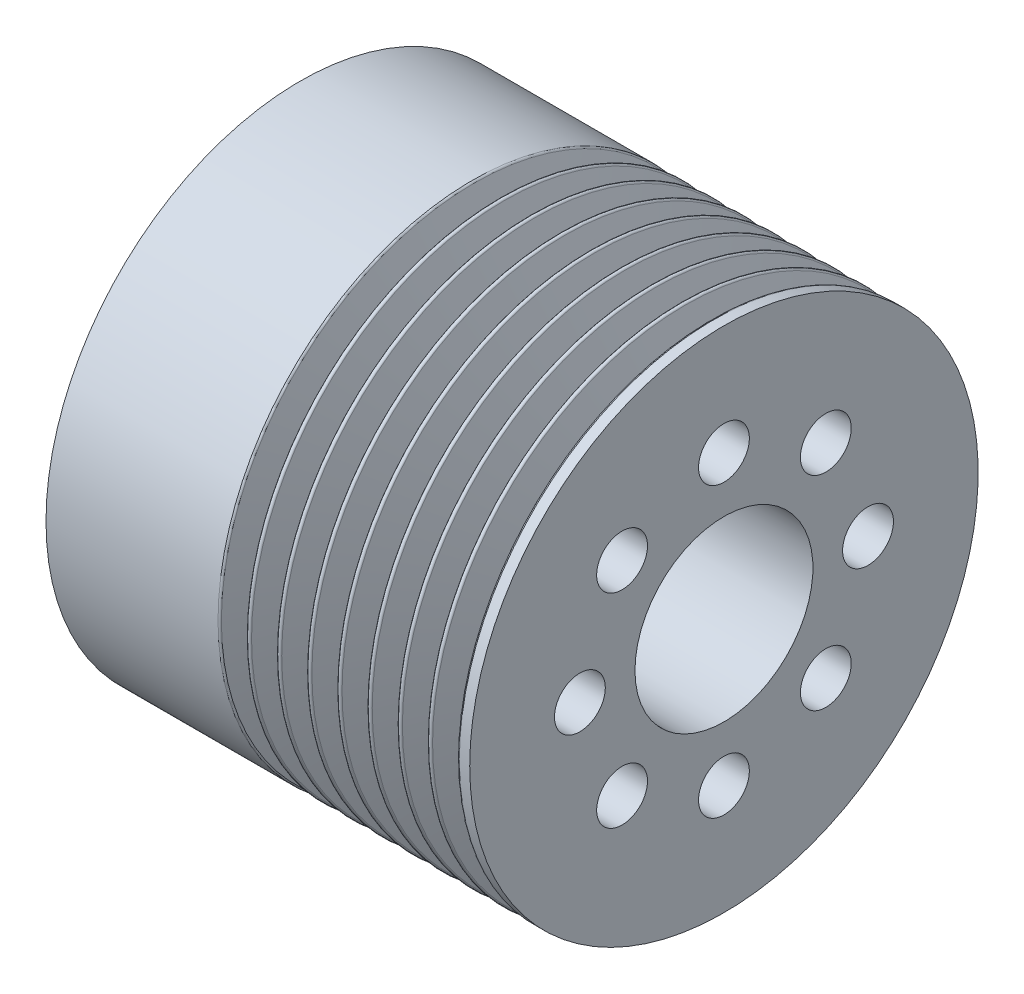
ISO-10303-21;
HEADER;
FILE_DESCRIPTION(('STEP AP214'),'2;1');
FILE_NAME('part.step','',(''),(''),'','','');
FILE_SCHEMA(('AUTOMOTIVE_DESIGN { 1 0 10303 214 1 1 1 1 }'));
ENDSEC;
DATA;
#1=APPLICATION_CONTEXT('core data for automotive mechanical design processes');
#2=APPLICATION_PROTOCOL_DEFINITION('international standard','automotive_design',2000,#1);
#3=PRODUCT_CONTEXT('',#1,'mechanical');
#4=PRODUCT('Part','Part','',(#3));
#5=PRODUCT_RELATED_PRODUCT_CATEGORY('part','',(#4));
#6=PRODUCT_DEFINITION_FORMATION('','',#4);
#7=PRODUCT_DEFINITION_CONTEXT('part definition',#1,'design');
#8=PRODUCT_DEFINITION('design','',#6,#7);
#9=PRODUCT_DEFINITION_SHAPE('','',#8);
#10=(LENGTH_UNIT() NAMED_UNIT(*) SI_UNIT(.MILLI.,.METRE.));
#11=(NAMED_UNIT(*) PLANE_ANGLE_UNIT() SI_UNIT($,.RADIAN.));
#12=(NAMED_UNIT(*) SI_UNIT($,.STERADIAN.) SOLID_ANGLE_UNIT());
#13=UNCERTAINTY_MEASURE_WITH_UNIT(LENGTH_MEASURE(1.E-05),#10,'distance_accuracy_value','');
#14=(GEOMETRIC_REPRESENTATION_CONTEXT(3) GLOBAL_UNCERTAINTY_ASSIGNED_CONTEXT((#13)) GLOBAL_UNIT_ASSIGNED_CONTEXT((#10,
#11,#12)) REPRESENTATION_CONTEXT('',''));
#15=CARTESIAN_POINT('',(0.,0.,0.));
#16=DIRECTION('',(0.,0.,1.));
#17=DIRECTION('',(1.,0.,0.));
#18=AXIS2_PLACEMENT_3D('',#15,#16,#17);
#19=CARTESIAN_POINT('',(0.,0.,0.));
#20=DIRECTION('',(-1.,0.,0.));
#21=DIRECTION('',(0.,0.,1.));
#22=AXIS2_PLACEMENT_3D('',#19,#20,#21);
#23=CYLINDRICAL_SURFACE('',#22,30.);
#24=CARTESIAN_POINT('',(-1.,0.,0.));
#25=DIRECTION('',(-1.,0.,0.));
#26=DIRECTION('',(0.,0.,1.));
#27=AXIS2_PLACEMENT_3D('',#24,#25,#26);
#28=CIRCLE('',#27,30.);
#29=CARTESIAN_POINT('',(-1.,0.,30.));
#30=VERTEX_POINT('',#29);
#31=EDGE_CURVE('E59',#30,#30,#28,.T.);
#32=ORIENTED_EDGE('',*,*,#31,.F.);
#33=EDGE_LOOP('',(#32));
#34=FACE_BOUND('',#33,.T.);
#35=CARTESIAN_POINT('',(19.3,0.,0.));
#36=DIRECTION('',(-1.,0.,0.));
#37=DIRECTION('',(0.,0.,1.));
#38=AXIS2_PLACEMENT_3D('',#35,#36,#37);
#39=CIRCLE('',#38,30.);
#40=CARTESIAN_POINT('',(19.3,0.,30.));
#41=VERTEX_POINT('',#40);
#42=EDGE_CURVE('E210',#41,#41,#39,.T.);
#43=ORIENTED_EDGE('',*,*,#42,.T.);
#44=EDGE_LOOP('',(#43));
#45=FACE_BOUND('',#44,.T.);
#46=ADVANCED_FACE('F45',(#34,#45),#23,.T.);
#47=CARTESIAN_POINT('',(31.5,10.5,0.));
#48=DIRECTION('',(1.,0.,0.));
#49=DIRECTION('',(0.,0.,-1.));
#50=AXIS2_PLACEMENT_3D('',#47,#48,#49);
#51=PLANE('',#50);
#52=CARTESIAN_POINT('',(31.5,12.0208152801713,12.0208152801713));
#53=DIRECTION('',(1.,0.,0.));
#54=DIRECTION('',(0.,0.,-1.));
#55=AXIS2_PLACEMENT_3D('',#52,#53,#54);
#56=CIRCLE('',#55,3.);
#57=CARTESIAN_POINT('',(31.5,12.0208152801713,9.02081528017131));
#58=VERTEX_POINT('',#57);
#59=EDGE_CURVE('E270',#58,#58,#56,.F.);
#60=ORIENTED_EDGE('',*,*,#59,.F.);
#61=EDGE_LOOP('',(#60));
#62=FACE_BOUND('',#61,.T.);
#63=CARTESIAN_POINT('',(31.5,-12.0208152801713,12.0208152801713));
#64=DIRECTION('',(1.,0.,0.));
#65=DIRECTION('',(0.,0.,-1.));
#66=AXIS2_PLACEMENT_3D('',#63,#64,#65);
#67=CIRCLE('',#66,3.);
#68=CARTESIAN_POINT('',(31.5,-12.0208152801713,9.02081528017131));
#69=VERTEX_POINT('',#68);
#70=EDGE_CURVE('E262',#69,#69,#67,.F.);
#71=ORIENTED_EDGE('',*,*,#70,.F.);
#72=EDGE_LOOP('',(#71));
#73=FACE_BOUND('',#72,.T.);
#74=CARTESIAN_POINT('',(31.5,-17.,0.));
#75=DIRECTION('',(1.,0.,0.));
#76=DIRECTION('',(0.,0.,-1.));
#77=AXIS2_PLACEMENT_3D('',#74,#75,#76);
#78=CIRCLE('',#77,3.);
#79=CARTESIAN_POINT('',(31.5,-17.,-3.));
#80=VERTEX_POINT('',#79);
#81=EDGE_CURVE('E254',#80,#80,#78,.F.);
#82=ORIENTED_EDGE('',*,*,#81,.F.);
#83=EDGE_LOOP('',(#82));
#84=FACE_BOUND('',#83,.T.);
#85=CARTESIAN_POINT('',(31.5,-12.0208152801713,-12.0208152801713));
#86=DIRECTION('',(1.,0.,0.));
#87=DIRECTION('',(0.,0.,-1.));
#88=AXIS2_PLACEMENT_3D('',#85,#86,#87);
#89=CIRCLE('',#88,3.);
#90=CARTESIAN_POINT('',(31.5,-12.0208152801713,-15.0208152801713));
#91=VERTEX_POINT('',#90);
#92=EDGE_CURVE('E246',#91,#91,#89,.F.);
#93=ORIENTED_EDGE('',*,*,#92,.F.);
#94=EDGE_LOOP('',(#93));
#95=FACE_BOUND('',#94,.T.);
#96=CARTESIAN_POINT('',(31.5,0.,-17.));
#97=DIRECTION('',(1.,0.,0.));
#98=DIRECTION('',(0.,0.,-1.));
#99=AXIS2_PLACEMENT_3D('',#96,#97,#98);
#100=CIRCLE('',#99,2.99999999999999);
#101=CARTESIAN_POINT('',(31.5,0.,-20.));
#102=VERTEX_POINT('',#101);
#103=EDGE_CURVE('E238',#102,#102,#100,.F.);
#104=ORIENTED_EDGE('',*,*,#103,.F.);
#105=EDGE_LOOP('',(#104));
#106=FACE_BOUND('',#105,.T.);
#107=CARTESIAN_POINT('',(31.5,12.0208152801713,-12.0208152801713));
#108=DIRECTION('',(1.,0.,0.));
#109=DIRECTION('',(0.,0.,-1.));
#110=AXIS2_PLACEMENT_3D('',#107,#108,#109);
#111=CIRCLE('',#110,3.);
#112=CARTESIAN_POINT('',(31.5,12.0208152801713,-15.0208152801713));
#113=VERTEX_POINT('',#112);
#114=EDGE_CURVE('E230',#113,#113,#111,.F.);
#115=ORIENTED_EDGE('',*,*,#114,.F.);
#116=EDGE_LOOP('',(#115));
#117=FACE_BOUND('',#116,.T.);
#118=CARTESIAN_POINT('',(31.5,0.,17.));
#119=DIRECTION('',(1.,0.,0.));
#120=DIRECTION('',(0.,0.,-1.));
#121=AXIS2_PLACEMENT_3D('',#118,#119,#120);
#122=CIRCLE('',#121,3.);
#123=CARTESIAN_POINT('',(31.5,0.,14.));
#124=VERTEX_POINT('',#123);
#125=EDGE_CURVE('E222',#124,#124,#122,.F.);
#126=ORIENTED_EDGE('',*,*,#125,.F.);
#127=EDGE_LOOP('',(#126));
#128=FACE_BOUND('',#127,.T.);
#129=CARTESIAN_POINT('',(31.5,17.,0.));
#130=DIRECTION('',(1.,0.,0.));
#131=DIRECTION('',(0.,0.,-1.));
#132=AXIS2_PLACEMENT_3D('',#129,#130,#131);
#133=CIRCLE('',#132,3.);
#134=CARTESIAN_POINT('',(31.5,17.,-3.));
#135=VERTEX_POINT('',#134);
#136=EDGE_CURVE('E214',#135,#135,#133,.F.);
#137=ORIENTED_EDGE('',*,*,#136,.F.);
#138=EDGE_LOOP('',(#137));
#139=FACE_BOUND('',#138,.T.);
#140=CARTESIAN_POINT('',(31.5,0.,0.));
#141=DIRECTION('',(-1.,0.,0.));
#142=DIRECTION('',(0.,0.,1.));
#143=AXIS2_PLACEMENT_3D('',#140,#141,#142);
#144=CIRCLE('',#143,10.5);
#145=CARTESIAN_POINT('',(31.5,0.,10.5));
#146=VERTEX_POINT('',#145);
#147=EDGE_CURVE('E74',#146,#146,#144,.T.);
#148=ORIENTED_EDGE('',*,*,#147,.F.);
#149=EDGE_LOOP('',(#148));
#150=FACE_BOUND('',#149,.T.);
#151=CARTESIAN_POINT('',(31.5,0.,0.));
#152=DIRECTION('',(-1.,0.,0.));
#153=DIRECTION('',(0.,0.,1.));
#154=AXIS2_PLACEMENT_3D('',#151,#152,#153);
#155=CIRCLE('',#154,21.5);
#156=CARTESIAN_POINT('',(31.5,0.,21.5));
#157=VERTEX_POINT('',#156);
#158=EDGE_CURVE('E10',#157,#157,#155,.T.);
#159=ORIENTED_EDGE('',*,*,#158,.T.);
#160=EDGE_LOOP('',(#159));
#161=FACE_BOUND('',#160,.T.);
#162=ADVANCED_FACE('F48',(#62,#73,#84,#95,#106,#117,#128,#139,#150,#161),#51,.F.);
#163=CARTESIAN_POINT('',(0.,0.,0.));
#164=DIRECTION('',(-1.,0.,0.));
#165=DIRECTION('',(0.,0.,1.));
#166=AXIS2_PLACEMENT_3D('',#163,#164,#165);
#167=CYLINDRICAL_SURFACE('',#166,21.5);
#168=ORIENTED_EDGE('',*,*,#158,.F.);
#169=EDGE_LOOP('',(#168));
#170=FACE_BOUND('',#169,.T.);
#171=CARTESIAN_POINT('',(-0.999999999999999,0.,0.));
#172=DIRECTION('',(-1.,0.,0.));
#173=DIRECTION('',(0.,0.,1.));
#174=AXIS2_PLACEMENT_3D('',#171,#172,#173);
#175=CIRCLE('',#174,21.5);
#176=CARTESIAN_POINT('',(-0.999999999999999,0.,21.5));
#177=VERTEX_POINT('',#176);
#178=EDGE_CURVE('E54',#177,#177,#175,.T.);
#179=ORIENTED_EDGE('',*,*,#178,.T.);
#180=EDGE_LOOP('',(#179));
#181=FACE_BOUND('',#180,.T.);
#182=ADVANCED_FACE('F312',(#170,#181),#167,.F.);
#183=CARTESIAN_POINT('',(-1.,30.,0.));
#184=DIRECTION('',(1.,0.,0.));
#185=DIRECTION('',(0.,0.,-1.));
#186=AXIS2_PLACEMENT_3D('',#183,#184,#185);
#187=PLANE('',#186);
#188=ORIENTED_EDGE('',*,*,#178,.F.);
#189=EDGE_LOOP('',(#188));
#190=FACE_BOUND('',#189,.T.);
#191=ORIENTED_EDGE('',*,*,#31,.T.);
#192=EDGE_LOOP('',(#191));
#193=FACE_BOUND('',#192,.T.);
#194=ADVANCED_FACE('F318',(#190,#193),#187,.F.);
#195=CARTESIAN_POINT('',(47.78,0.,0.));
#196=DIRECTION('',(-1.,0.,0.));
#197=DIRECTION('',(0.,0.,1.));
#198=AXIS2_PLACEMENT_3D('',#195,#196,#197);
#199=CIRCLE('',#198,30.);
#200=CARTESIAN_POINT('',(47.78,0.,30.));
#201=VERTEX_POINT('',#200);
#202=EDGE_CURVE('E94',#201,#201,#199,.T.);
#203=ORIENTED_EDGE('',*,*,#202,.F.);
#204=EDGE_LOOP('',(#203));
#205=FACE_BOUND('',#204,.T.);
#206=CARTESIAN_POINT('',(49.,0.,0.));
#207=DIRECTION('',(-1.,0.,0.));
#208=DIRECTION('',(0.,0.,1.));
#209=AXIS2_PLACEMENT_3D('',#206,#207,#208);
#210=CIRCLE('',#209,30.);
#211=CARTESIAN_POINT('',(49.,0.,30.));
#212=VERTEX_POINT('',#211);
#213=EDGE_CURVE('E64',#212,#212,#210,.T.);
#214=ORIENTED_EDGE('',*,*,#213,.T.);
#215=EDGE_LOOP('',(#214));
#216=FACE_BOUND('',#215,.T.);
#217=ADVANCED_FACE('F285',(#205,#216),#23,.T.);
#218=CARTESIAN_POINT('',(49.,10.5,0.));
#219=DIRECTION('',(-1.,0.,0.));
#220=DIRECTION('',(0.,0.,1.));
#221=AXIS2_PLACEMENT_3D('',#218,#219,#220);
#222=PLANE('',#221);
#223=CARTESIAN_POINT('',(49.,12.0208152801713,12.0208152801713));
#224=DIRECTION('',(1.,0.,0.));
#225=DIRECTION('',(0.,0.,-1.));
#226=AXIS2_PLACEMENT_3D('',#223,#224,#225);
#227=CIRCLE('',#226,3.);
#228=CARTESIAN_POINT('',(49.,12.0208152801713,9.02081528017131));
#229=VERTEX_POINT('',#228);
#230=EDGE_CURVE('E274',#229,#229,#227,.T.);
#231=ORIENTED_EDGE('',*,*,#230,.F.);
#232=EDGE_LOOP('',(#231));
#233=FACE_BOUND('',#232,.T.);
#234=CARTESIAN_POINT('',(49.,-12.0208152801713,12.0208152801713));
#235=DIRECTION('',(1.,0.,0.));
#236=DIRECTION('',(0.,0.,-1.));
#237=AXIS2_PLACEMENT_3D('',#234,#235,#236);
#238=CIRCLE('',#237,3.);
#239=CARTESIAN_POINT('',(49.,-12.0208152801713,9.02081528017131));
#240=VERTEX_POINT('',#239);
#241=EDGE_CURVE('E266',#240,#240,#238,.T.);
#242=ORIENTED_EDGE('',*,*,#241,.F.);
#243=EDGE_LOOP('',(#242));
#244=FACE_BOUND('',#243,.T.);
#245=CARTESIAN_POINT('',(49.,-17.,0.));
#246=DIRECTION('',(1.,0.,0.));
#247=DIRECTION('',(0.,0.,-1.));
#248=AXIS2_PLACEMENT_3D('',#245,#246,#247);
#249=CIRCLE('',#248,3.);
#250=CARTESIAN_POINT('',(49.,-17.,-3.));
#251=VERTEX_POINT('',#250);
#252=EDGE_CURVE('E258',#251,#251,#249,.T.);
#253=ORIENTED_EDGE('',*,*,#252,.F.);
#254=EDGE_LOOP('',(#253));
#255=FACE_BOUND('',#254,.T.);
#256=CARTESIAN_POINT('',(49.,-12.0208152801713,-12.0208152801713));
#257=DIRECTION('',(1.,0.,0.));
#258=DIRECTION('',(0.,0.,-1.));
#259=AXIS2_PLACEMENT_3D('',#256,#257,#258);
#260=CIRCLE('',#259,3.);
#261=CARTESIAN_POINT('',(49.,-12.0208152801713,-15.0208152801713));
#262=VERTEX_POINT('',#261);
#263=EDGE_CURVE('E250',#262,#262,#260,.T.);
#264=ORIENTED_EDGE('',*,*,#263,.F.);
#265=EDGE_LOOP('',(#264));
#266=FACE_BOUND('',#265,.T.);
#267=CARTESIAN_POINT('',(49.,0.,-17.));
#268=DIRECTION('',(1.,0.,0.));
#269=DIRECTION('',(0.,0.,-1.));
#270=AXIS2_PLACEMENT_3D('',#267,#268,#269);
#271=CIRCLE('',#270,2.99999999999999);
#272=CARTESIAN_POINT('',(49.,0.,-20.));
#273=VERTEX_POINT('',#272);
#274=EDGE_CURVE('E242',#273,#273,#271,.T.);
#275=ORIENTED_EDGE('',*,*,#274,.F.);
#276=EDGE_LOOP('',(#275));
#277=FACE_BOUND('',#276,.T.);
#278=CARTESIAN_POINT('',(49.,12.0208152801713,-12.0208152801713));
#279=DIRECTION('',(1.,0.,0.));
#280=DIRECTION('',(0.,0.,-1.));
#281=AXIS2_PLACEMENT_3D('',#278,#279,#280);
#282=CIRCLE('',#281,3.);
#283=CARTESIAN_POINT('',(49.,12.0208152801713,-15.0208152801713));
#284=VERTEX_POINT('',#283);
#285=EDGE_CURVE('E234',#284,#284,#282,.T.);
#286=ORIENTED_EDGE('',*,*,#285,.F.);
#287=EDGE_LOOP('',(#286));
#288=FACE_BOUND('',#287,.T.);
#289=CARTESIAN_POINT('',(49.,0.,17.));
#290=DIRECTION('',(1.,0.,0.));
#291=DIRECTION('',(0.,0.,-1.));
#292=AXIS2_PLACEMENT_3D('',#289,#290,#291);
#293=CIRCLE('',#292,3.);
#294=CARTESIAN_POINT('',(49.,0.,14.));
#295=VERTEX_POINT('',#294);
#296=EDGE_CURVE('E226',#295,#295,#293,.T.);
#297=ORIENTED_EDGE('',*,*,#296,.F.);
#298=EDGE_LOOP('',(#297));
#299=FACE_BOUND('',#298,.T.);
#300=CARTESIAN_POINT('',(49.,17.,0.));
#301=DIRECTION('',(1.,0.,0.));
#302=DIRECTION('',(0.,0.,-1.));
#303=AXIS2_PLACEMENT_3D('',#300,#301,#302);
#304=CIRCLE('',#303,3.);
#305=CARTESIAN_POINT('',(49.,17.,-3.));
#306=VERTEX_POINT('',#305);
#307=EDGE_CURVE('E218',#306,#306,#304,.T.);
#308=ORIENTED_EDGE('',*,*,#307,.F.);
#309=EDGE_LOOP('',(#308));
#310=FACE_BOUND('',#309,.T.);
#311=ORIENTED_EDGE('',*,*,#213,.F.);
#312=EDGE_LOOP('',(#311));
#313=FACE_BOUND('',#312,.T.);
#314=CARTESIAN_POINT('',(49.,0.,0.));
#315=DIRECTION('',(-1.,0.,0.));
#316=DIRECTION('',(0.,0.,1.));
#317=AXIS2_PLACEMENT_3D('',#314,#315,#316);
#318=CIRCLE('',#317,10.5);
#319=CARTESIAN_POINT('',(49.,0.,10.5));
#320=VERTEX_POINT('',#319);
#321=EDGE_CURVE('E70',#320,#320,#318,.T.);
#322=ORIENTED_EDGE('',*,*,#321,.T.);
#323=EDGE_LOOP('',(#322));
#324=FACE_BOUND('',#323,.T.);
#325=ADVANCED_FACE('F281',(#233,#244,#255,#266,#277,#288,#299,#310,#313,#324),#222,.F.);
#326=CARTESIAN_POINT('',(0.,0.,0.));
#327=DIRECTION('',(-1.,0.,0.));
#328=DIRECTION('',(0.,0.,1.));
#329=AXIS2_PLACEMENT_3D('',#326,#327,#328);
#330=CYLINDRICAL_SURFACE('',#329,10.5);
#331=ORIENTED_EDGE('',*,*,#321,.F.);
#332=EDGE_LOOP('',(#331));
#333=FACE_BOUND('',#332,.T.);
#334=ORIENTED_EDGE('',*,*,#147,.T.);
#335=EDGE_LOOP('',(#334));
#336=FACE_BOUND('',#335,.T.);
#337=ADVANCED_FACE('F284',(#333,#336),#330,.F.);
#338=CARTESIAN_POINT('',(47.78,0.,0.));
#339=DIRECTION('',(-1.,0.,0.));
#340=DIRECTION('',(0.,0.,1.));
#341=AXIS2_PLACEMENT_3D('',#338,#339,#340);
#342=TOROIDAL_SURFACE('',#341,29.75,0.250000000000002);
#343=ORIENTED_EDGE('',*,*,#202,.T.);
#344=EDGE_LOOP('',(#343));
#345=FACE_BOUND('',#344,.T.);
#346=CARTESIAN_POINT('',(47.5458319526879,0.,0.));
#347=DIRECTION('',(-1.,0.,0.));
#348=DIRECTION('',(0.,0.,1.));
#349=AXIS2_PLACEMENT_3D('',#346,#347,#348);
#350=CIRCLE('',#349,29.8375518453149);
#351=CARTESIAN_POINT('',(47.5458319526879,0.,29.8375518453149));
#352=VERTEX_POINT('',#351);
#353=EDGE_CURVE('E78',#352,#352,#350,.T.);
#354=ORIENTED_EDGE('',*,*,#353,.F.);
#355=EDGE_LOOP('',(#354));
#356=FACE_BOUND('',#355,.T.);
#357=ADVANCED_FACE('F307',(#345,#356),#342,.T.);
#358=CARTESIAN_POINT('',(46.2810016567745,0.,0.));
#359=DIRECTION('',(1.,0.,0.));
#360=DIRECTION('',(0.,0.,-1.));
#361=AXIS2_PLACEMENT_3D('',#358,#359,#360);
#362=CONICAL_SURFACE('',#361,26.4546095496951,1.21300383013606);
#363=ORIENTED_EDGE('',*,*,#353,.T.);
#364=EDGE_LOOP('',(#363));
#365=FACE_BOUND('',#364,.T.);
#366=CARTESIAN_POINT('',(46.2810016567745,0.,0.));
#367=DIRECTION('',(-1.,0.,0.));
#368=DIRECTION('',(0.,0.,1.));
#369=AXIS2_PLACEMENT_3D('',#366,#367,#368);
#370=CIRCLE('',#369,26.4546095496951);
#371=CARTESIAN_POINT('',(46.2810016567745,0.,26.4546095496951));
#372=VERTEX_POINT('',#371);
#373=EDGE_CURVE('E82',#372,#372,#370,.T.);
#374=ORIENTED_EDGE('',*,*,#373,.F.);
#375=EDGE_LOOP('',(#374));
#376=FACE_BOUND('',#375,.T.);
#377=ADVANCED_FACE('F508',(#365,#376),#362,.T.);
#378=CARTESIAN_POINT('',(46.,0.,0.));
#379=DIRECTION('',(-1.,0.,0.));
#380=DIRECTION('',(0.,0.,1.));
#381=AXIS2_PLACEMENT_3D('',#378,#379,#380);
#382=TOROIDAL_SURFACE('',#381,26.5596717640729,0.300000000000001);
#383=ORIENTED_EDGE('',*,*,#373,.T.);
#384=EDGE_LOOP('',(#383));
#385=FACE_BOUND('',#384,.T.);
#386=CARTESIAN_POINT('',(45.7189983432255,0.,0.));
#387=DIRECTION('',(-1.,0.,0.));
#388=DIRECTION('',(0.,0.,1.));
#389=AXIS2_PLACEMENT_3D('',#386,#387,#388);
#390=CIRCLE('',#389,26.4546095496951);
#391=CARTESIAN_POINT('',(45.7189983432255,0.,26.4546095496951));
#392=VERTEX_POINT('',#391);
#393=EDGE_CURVE('E86',#392,#392,#390,.T.);
#394=ORIENTED_EDGE('',*,*,#393,.F.);
#395=EDGE_LOOP('',(#394));
#396=FACE_BOUND('',#395,.T.);
#397=ADVANCED_FACE('F503',(#385,#396),#382,.F.);
#398=CARTESIAN_POINT('',(44.4541680473121,0.,0.));
#399=DIRECTION('',(-1.,0.,0.));
#400=DIRECTION('',(0.,0.,1.));
#401=AXIS2_PLACEMENT_3D('',#398,#399,#400);
#402=CONICAL_SURFACE('',#401,29.8375518453149,1.21300383013606);
#403=ORIENTED_EDGE('',*,*,#393,.T.);
#404=EDGE_LOOP('',(#403));
#405=FACE_BOUND('',#404,.T.);
#406=CARTESIAN_POINT('',(44.4541680473121,0.,0.));
#407=DIRECTION('',(-1.,0.,0.));
#408=DIRECTION('',(0.,0.,1.));
#409=AXIS2_PLACEMENT_3D('',#406,#407,#408);
#410=CIRCLE('',#409,29.8375518453149);
#411=CARTESIAN_POINT('',(44.4541680473121,0.,29.8375518453149));
#412=VERTEX_POINT('',#411);
#413=EDGE_CURVE('E90',#412,#412,#410,.T.);
#414=ORIENTED_EDGE('',*,*,#413,.F.);
#415=EDGE_LOOP('',(#414));
#416=FACE_BOUND('',#415,.T.);
#417=ADVANCED_FACE('F498',(#405,#416),#402,.T.);
#418=CARTESIAN_POINT('',(44.22,0.,0.));
#419=DIRECTION('',(-1.,0.,0.));
#420=DIRECTION('',(0.,0.,1.));
#421=AXIS2_PLACEMENT_3D('',#418,#419,#420);
#422=TOROIDAL_SURFACE('',#421,29.75,0.250000000000006);
#423=ORIENTED_EDGE('',*,*,#413,.T.);
#424=EDGE_LOOP('',(#423));
#425=FACE_BOUND('',#424,.T.);
#426=CARTESIAN_POINT('',(43.9858319526879,0.,0.));
#427=DIRECTION('',(-1.,0.,0.));
#428=DIRECTION('',(0.,0.,1.));
#429=AXIS2_PLACEMENT_3D('',#426,#427,#428);
#430=CIRCLE('',#429,29.8375518453149);
#431=CARTESIAN_POINT('',(43.9858319526879,0.,29.8375518453149));
#432=VERTEX_POINT('',#431);
#433=EDGE_CURVE('E98',#432,#432,#430,.T.);
#434=ORIENTED_EDGE('',*,*,#433,.F.);
#435=EDGE_LOOP('',(#434));
#436=FACE_BOUND('',#435,.T.);
#437=ADVANCED_FACE('F493',(#425,#436),#422,.T.);
#438=CARTESIAN_POINT('',(42.7210016567745,0.,0.));
#439=DIRECTION('',(1.,0.,0.));
#440=DIRECTION('',(0.,0.,-1.));
#441=AXIS2_PLACEMENT_3D('',#438,#439,#440);
#442=CONICAL_SURFACE('',#441,26.4546095496951,1.21300383013606);
#443=ORIENTED_EDGE('',*,*,#433,.T.);
#444=EDGE_LOOP('',(#443));
#445=FACE_BOUND('',#444,.T.);
#446=CARTESIAN_POINT('',(42.7210016567745,0.,0.));
#447=DIRECTION('',(-1.,0.,0.));
#448=DIRECTION('',(0.,0.,1.));
#449=AXIS2_PLACEMENT_3D('',#446,#447,#448);
#450=CIRCLE('',#449,26.4546095496951);
#451=CARTESIAN_POINT('',(42.7210016567745,0.,26.4546095496951));
#452=VERTEX_POINT('',#451);
#453=EDGE_CURVE('E102',#452,#452,#450,.T.);
#454=ORIENTED_EDGE('',*,*,#453,.F.);
#455=EDGE_LOOP('',(#454));
#456=FACE_BOUND('',#455,.T.);
#457=ADVANCED_FACE('F488',(#445,#456),#442,.T.);
#458=CARTESIAN_POINT('',(42.44,0.,0.));
#459=DIRECTION('',(-1.,0.,0.));
#460=DIRECTION('',(0.,0.,1.));
#461=AXIS2_PLACEMENT_3D('',#458,#459,#460);
#462=TOROIDAL_SURFACE('',#461,26.5596717640729,0.300000000000001);
#463=ORIENTED_EDGE('',*,*,#453,.T.);
#464=EDGE_LOOP('',(#463));
#465=FACE_BOUND('',#464,.T.);
#466=CARTESIAN_POINT('',(42.1589983432255,0.,0.));
#467=DIRECTION('',(-1.,0.,0.));
#468=DIRECTION('',(0.,0.,1.));
#469=AXIS2_PLACEMENT_3D('',#466,#467,#468);
#470=CIRCLE('',#469,26.4546095496951);
#471=CARTESIAN_POINT('',(42.1589983432255,0.,26.4546095496951));
#472=VERTEX_POINT('',#471);
#473=EDGE_CURVE('E106',#472,#472,#470,.T.);
#474=ORIENTED_EDGE('',*,*,#473,.F.);
#475=EDGE_LOOP('',(#474));
#476=FACE_BOUND('',#475,.T.);
#477=ADVANCED_FACE('F483',(#465,#476),#462,.F.);
#478=CARTESIAN_POINT('',(40.8941680473121,0.,0.));
#479=DIRECTION('',(-1.,0.,0.));
#480=DIRECTION('',(0.,0.,1.));
#481=AXIS2_PLACEMENT_3D('',#478,#479,#480);
#482=CONICAL_SURFACE('',#481,29.8375518453149,1.21300383013606);
#483=ORIENTED_EDGE('',*,*,#473,.T.);
#484=EDGE_LOOP('',(#483));
#485=FACE_BOUND('',#484,.T.);
#486=CARTESIAN_POINT('',(40.8941680473121,0.,0.));
#487=DIRECTION('',(-1.,0.,0.));
#488=DIRECTION('',(0.,0.,1.));
#489=AXIS2_PLACEMENT_3D('',#486,#487,#488);
#490=CIRCLE('',#489,29.8375518453149);
#491=CARTESIAN_POINT('',(40.8941680473121,0.,29.8375518453149));
#492=VERTEX_POINT('',#491);
#493=EDGE_CURVE('E110',#492,#492,#490,.T.);
#494=ORIENTED_EDGE('',*,*,#493,.F.);
#495=EDGE_LOOP('',(#494));
#496=FACE_BOUND('',#495,.T.);
#497=ADVANCED_FACE('F478',(#485,#496),#482,.T.);
#498=CARTESIAN_POINT('',(40.66,0.,0.));
#499=DIRECTION('',(-1.,0.,0.));
#500=DIRECTION('',(0.,0.,1.));
#501=AXIS2_PLACEMENT_3D('',#498,#499,#500);
#502=TOROIDAL_SURFACE('',#501,29.75,0.250000000000006);
#503=ORIENTED_EDGE('',*,*,#493,.T.);
#504=EDGE_LOOP('',(#503));
#505=FACE_BOUND('',#504,.T.);
#506=CARTESIAN_POINT('',(40.4258319526879,0.,0.));
#507=DIRECTION('',(-1.,0.,0.));
#508=DIRECTION('',(0.,0.,1.));
#509=AXIS2_PLACEMENT_3D('',#506,#507,#508);
#510=CIRCLE('',#509,29.8375518453149);
#511=CARTESIAN_POINT('',(40.4258319526879,0.,29.8375518453149));
#512=VERTEX_POINT('',#511);
#513=EDGE_CURVE('E114',#512,#512,#510,.T.);
#514=ORIENTED_EDGE('',*,*,#513,.F.);
#515=EDGE_LOOP('',(#514));
#516=FACE_BOUND('',#515,.T.);
#517=ADVANCED_FACE('F473',(#505,#516),#502,.T.);
#518=CARTESIAN_POINT('',(39.1610016567745,0.,0.));
#519=DIRECTION('',(1.,0.,0.));
#520=DIRECTION('',(0.,0.,-1.));
#521=AXIS2_PLACEMENT_3D('',#518,#519,#520);
#522=CONICAL_SURFACE('',#521,26.4546095496951,1.21300383013606);
#523=ORIENTED_EDGE('',*,*,#513,.T.);
#524=EDGE_LOOP('',(#523));
#525=FACE_BOUND('',#524,.T.);
#526=CARTESIAN_POINT('',(39.1610016567745,0.,0.));
#527=DIRECTION('',(-1.,0.,0.));
#528=DIRECTION('',(0.,0.,1.));
#529=AXIS2_PLACEMENT_3D('',#526,#527,#528);
#530=CIRCLE('',#529,26.4546095496951);
#531=CARTESIAN_POINT('',(39.1610016567745,0.,26.4546095496951));
#532=VERTEX_POINT('',#531);
#533=EDGE_CURVE('E118',#532,#532,#530,.T.);
#534=ORIENTED_EDGE('',*,*,#533,.F.);
#535=EDGE_LOOP('',(#534));
#536=FACE_BOUND('',#535,.T.);
#537=ADVANCED_FACE('F468',(#525,#536),#522,.T.);
#538=CARTESIAN_POINT('',(38.88,0.,0.));
#539=DIRECTION('',(-1.,0.,0.));
#540=DIRECTION('',(0.,0.,1.));
#541=AXIS2_PLACEMENT_3D('',#538,#539,#540);
#542=TOROIDAL_SURFACE('',#541,26.5596717640729,0.300000000000001);
#543=ORIENTED_EDGE('',*,*,#533,.T.);
#544=EDGE_LOOP('',(#543));
#545=FACE_BOUND('',#544,.T.);
#546=CARTESIAN_POINT('',(38.5989983432255,0.,0.));
#547=DIRECTION('',(-1.,0.,0.));
#548=DIRECTION('',(0.,0.,1.));
#549=AXIS2_PLACEMENT_3D('',#546,#547,#548);
#550=CIRCLE('',#549,26.4546095496951);
#551=CARTESIAN_POINT('',(38.5989983432255,0.,26.4546095496951));
#552=VERTEX_POINT('',#551);
#553=EDGE_CURVE('E122',#552,#552,#550,.T.);
#554=ORIENTED_EDGE('',*,*,#553,.F.);
#555=EDGE_LOOP('',(#554));
#556=FACE_BOUND('',#555,.T.);
#557=ADVANCED_FACE('F463',(#545,#556),#542,.F.);
#558=CARTESIAN_POINT('',(37.3341680473121,0.,0.));
#559=DIRECTION('',(-1.,0.,0.));
#560=DIRECTION('',(0.,0.,1.));
#561=AXIS2_PLACEMENT_3D('',#558,#559,#560);
#562=CONICAL_SURFACE('',#561,29.8375518453149,1.21300383013606);
#563=ORIENTED_EDGE('',*,*,#553,.T.);
#564=EDGE_LOOP('',(#563));
#565=FACE_BOUND('',#564,.T.);
#566=CARTESIAN_POINT('',(37.3341680473121,0.,0.));
#567=DIRECTION('',(-1.,0.,0.));
#568=DIRECTION('',(0.,0.,1.));
#569=AXIS2_PLACEMENT_3D('',#566,#567,#568);
#570=CIRCLE('',#569,29.8375518453149);
#571=CARTESIAN_POINT('',(37.3341680473121,0.,29.8375518453149));
#572=VERTEX_POINT('',#571);
#573=EDGE_CURVE('E126',#572,#572,#570,.T.);
#574=ORIENTED_EDGE('',*,*,#573,.F.);
#575=EDGE_LOOP('',(#574));
#576=FACE_BOUND('',#575,.T.);
#577=ADVANCED_FACE('F458',(#565,#576),#562,.T.);
#578=CARTESIAN_POINT('',(37.1,0.,0.));
#579=DIRECTION('',(-1.,0.,0.));
#580=DIRECTION('',(0.,0.,1.));
#581=AXIS2_PLACEMENT_3D('',#578,#579,#580);
#582=TOROIDAL_SURFACE('',#581,29.75,0.250000000000006);
#583=ORIENTED_EDGE('',*,*,#573,.T.);
#584=EDGE_LOOP('',(#583));
#585=FACE_BOUND('',#584,.T.);
#586=CARTESIAN_POINT('',(36.8658319526879,0.,0.));
#587=DIRECTION('',(-1.,0.,0.));
#588=DIRECTION('',(0.,0.,1.));
#589=AXIS2_PLACEMENT_3D('',#586,#587,#588);
#590=CIRCLE('',#589,29.8375518453149);
#591=CARTESIAN_POINT('',(36.8658319526879,0.,29.8375518453149));
#592=VERTEX_POINT('',#591);
#593=EDGE_CURVE('E130',#592,#592,#590,.T.);
#594=ORIENTED_EDGE('',*,*,#593,.F.);
#595=EDGE_LOOP('',(#594));
#596=FACE_BOUND('',#595,.T.);
#597=ADVANCED_FACE('F453',(#585,#596),#582,.T.);
#598=CARTESIAN_POINT('',(35.6010016567745,0.,0.));
#599=DIRECTION('',(1.,0.,0.));
#600=DIRECTION('',(0.,0.,-1.));
#601=AXIS2_PLACEMENT_3D('',#598,#599,#600);
#602=CONICAL_SURFACE('',#601,26.4546095496951,1.21300383013606);
#603=ORIENTED_EDGE('',*,*,#593,.T.);
#604=EDGE_LOOP('',(#603));
#605=FACE_BOUND('',#604,.T.);
#606=CARTESIAN_POINT('',(35.6010016567745,0.,0.));
#607=DIRECTION('',(-1.,0.,0.));
#608=DIRECTION('',(0.,0.,1.));
#609=AXIS2_PLACEMENT_3D('',#606,#607,#608);
#610=CIRCLE('',#609,26.4546095496951);
#611=CARTESIAN_POINT('',(35.6010016567745,0.,26.4546095496951));
#612=VERTEX_POINT('',#611);
#613=EDGE_CURVE('E134',#612,#612,#610,.T.);
#614=ORIENTED_EDGE('',*,*,#613,.F.);
#615=EDGE_LOOP('',(#614));
#616=FACE_BOUND('',#615,.T.);
#617=ADVANCED_FACE('F448',(#605,#616),#602,.T.);
#618=CARTESIAN_POINT('',(35.32,0.,0.));
#619=DIRECTION('',(-1.,0.,0.));
#620=DIRECTION('',(0.,0.,1.));
#621=AXIS2_PLACEMENT_3D('',#618,#619,#620);
#622=TOROIDAL_SURFACE('',#621,26.5596717640729,0.300000000000001);
#623=ORIENTED_EDGE('',*,*,#613,.T.);
#624=EDGE_LOOP('',(#623));
#625=FACE_BOUND('',#624,.T.);
#626=CARTESIAN_POINT('',(35.0389983432255,0.,0.));
#627=DIRECTION('',(-1.,0.,0.));
#628=DIRECTION('',(0.,0.,1.));
#629=AXIS2_PLACEMENT_3D('',#626,#627,#628);
#630=CIRCLE('',#629,26.4546095496951);
#631=CARTESIAN_POINT('',(35.0389983432255,0.,26.4546095496951));
#632=VERTEX_POINT('',#631);
#633=EDGE_CURVE('E138',#632,#632,#630,.T.);
#634=ORIENTED_EDGE('',*,*,#633,.F.);
#635=EDGE_LOOP('',(#634));
#636=FACE_BOUND('',#635,.T.);
#637=ADVANCED_FACE('F443',(#625,#636),#622,.F.);
#638=CARTESIAN_POINT('',(33.7741680473121,0.,0.));
#639=DIRECTION('',(-1.,0.,0.));
#640=DIRECTION('',(0.,0.,1.));
#641=AXIS2_PLACEMENT_3D('',#638,#639,#640);
#642=CONICAL_SURFACE('',#641,29.8375518453149,1.21300383013606);
#643=ORIENTED_EDGE('',*,*,#633,.T.);
#644=EDGE_LOOP('',(#643));
#645=FACE_BOUND('',#644,.T.);
#646=CARTESIAN_POINT('',(33.7741680473121,0.,0.));
#647=DIRECTION('',(-1.,0.,0.));
#648=DIRECTION('',(0.,0.,1.));
#649=AXIS2_PLACEMENT_3D('',#646,#647,#648);
#650=CIRCLE('',#649,29.8375518453149);
#651=CARTESIAN_POINT('',(33.7741680473121,0.,29.8375518453149));
#652=VERTEX_POINT('',#651);
#653=EDGE_CURVE('E142',#652,#652,#650,.T.);
#654=ORIENTED_EDGE('',*,*,#653,.F.);
#655=EDGE_LOOP('',(#654));
#656=FACE_BOUND('',#655,.T.);
#657=ADVANCED_FACE('F438',(#645,#656),#642,.T.);
#658=CARTESIAN_POINT('',(33.54,0.,0.));
#659=DIRECTION('',(-1.,0.,0.));
#660=DIRECTION('',(0.,0.,1.));
#661=AXIS2_PLACEMENT_3D('',#658,#659,#660);
#662=TOROIDAL_SURFACE('',#661,29.75,0.250000000000006);
#663=ORIENTED_EDGE('',*,*,#653,.T.);
#664=EDGE_LOOP('',(#663));
#665=FACE_BOUND('',#664,.T.);
#666=CARTESIAN_POINT('',(33.3058319526879,0.,0.));
#667=DIRECTION('',(-1.,0.,0.));
#668=DIRECTION('',(0.,0.,1.));
#669=AXIS2_PLACEMENT_3D('',#666,#667,#668);
#670=CIRCLE('',#669,29.8375518453149);
#671=CARTESIAN_POINT('',(33.3058319526879,0.,29.8375518453149));
#672=VERTEX_POINT('',#671);
#673=EDGE_CURVE('E146',#672,#672,#670,.T.);
#674=ORIENTED_EDGE('',*,*,#673,.F.);
#675=EDGE_LOOP('',(#674));
#676=FACE_BOUND('',#675,.T.);
#677=ADVANCED_FACE('F433',(#665,#676),#662,.T.);
#678=CARTESIAN_POINT('',(32.0410016567745,0.,0.));
#679=DIRECTION('',(1.,0.,0.));
#680=DIRECTION('',(0.,0.,-1.));
#681=AXIS2_PLACEMENT_3D('',#678,#679,#680);
#682=CONICAL_SURFACE('',#681,26.4546095496951,1.21300383013606);
#683=ORIENTED_EDGE('',*,*,#673,.T.);
#684=EDGE_LOOP('',(#683));
#685=FACE_BOUND('',#684,.T.);
#686=CARTESIAN_POINT('',(32.0410016567745,0.,0.));
#687=DIRECTION('',(-1.,0.,0.));
#688=DIRECTION('',(0.,0.,1.));
#689=AXIS2_PLACEMENT_3D('',#686,#687,#688);
#690=CIRCLE('',#689,26.4546095496951);
#691=CARTESIAN_POINT('',(32.0410016567745,0.,26.4546095496951));
#692=VERTEX_POINT('',#691);
#693=EDGE_CURVE('E150',#692,#692,#690,.T.);
#694=ORIENTED_EDGE('',*,*,#693,.F.);
#695=EDGE_LOOP('',(#694));
#696=FACE_BOUND('',#695,.T.);
#697=ADVANCED_FACE('F428',(#685,#696),#682,.T.);
#698=CARTESIAN_POINT('',(31.76,0.,0.));
#699=DIRECTION('',(-1.,0.,0.));
#700=DIRECTION('',(0.,0.,1.));
#701=AXIS2_PLACEMENT_3D('',#698,#699,#700);
#702=TOROIDAL_SURFACE('',#701,26.5596717640729,0.300000000000001);
#703=ORIENTED_EDGE('',*,*,#693,.T.);
#704=EDGE_LOOP('',(#703));
#705=FACE_BOUND('',#704,.T.);
#706=CARTESIAN_POINT('',(31.4789983432255,0.,0.));
#707=DIRECTION('',(-1.,0.,0.));
#708=DIRECTION('',(0.,0.,1.));
#709=AXIS2_PLACEMENT_3D('',#706,#707,#708);
#710=CIRCLE('',#709,26.4546095496951);
#711=CARTESIAN_POINT('',(31.4789983432255,0.,26.4546095496951));
#712=VERTEX_POINT('',#711);
#713=EDGE_CURVE('E154',#712,#712,#710,.T.);
#714=ORIENTED_EDGE('',*,*,#713,.F.);
#715=EDGE_LOOP('',(#714));
#716=FACE_BOUND('',#715,.T.);
#717=ADVANCED_FACE('F423',(#705,#716),#702,.F.);
#718=CARTESIAN_POINT('',(30.2141680473121,0.,0.));
#719=DIRECTION('',(-1.,0.,0.));
#720=DIRECTION('',(0.,0.,1.));
#721=AXIS2_PLACEMENT_3D('',#718,#719,#720);
#722=CONICAL_SURFACE('',#721,29.8375518453149,1.21300383013606);
#723=ORIENTED_EDGE('',*,*,#713,.T.);
#724=EDGE_LOOP('',(#723));
#725=FACE_BOUND('',#724,.T.);
#726=CARTESIAN_POINT('',(30.2141680473121,0.,0.));
#727=DIRECTION('',(-1.,0.,0.));
#728=DIRECTION('',(0.,0.,1.));
#729=AXIS2_PLACEMENT_3D('',#726,#727,#728);
#730=CIRCLE('',#729,29.8375518453149);
#731=CARTESIAN_POINT('',(30.2141680473121,0.,29.8375518453149));
#732=VERTEX_POINT('',#731);
#733=EDGE_CURVE('E158',#732,#732,#730,.T.);
#734=ORIENTED_EDGE('',*,*,#733,.F.);
#735=EDGE_LOOP('',(#734));
#736=FACE_BOUND('',#735,.T.);
#737=ADVANCED_FACE('F418',(#725,#736),#722,.T.);
#738=CARTESIAN_POINT('',(29.98,0.,0.));
#739=DIRECTION('',(-1.,0.,0.));
#740=DIRECTION('',(0.,0.,1.));
#741=AXIS2_PLACEMENT_3D('',#738,#739,#740);
#742=TOROIDAL_SURFACE('',#741,29.75,0.250000000000006);
#743=ORIENTED_EDGE('',*,*,#733,.T.);
#744=EDGE_LOOP('',(#743));
#745=FACE_BOUND('',#744,.T.);
#746=CARTESIAN_POINT('',(29.7458319526879,0.,0.));
#747=DIRECTION('',(-1.,0.,0.));
#748=DIRECTION('',(0.,0.,1.));
#749=AXIS2_PLACEMENT_3D('',#746,#747,#748);
#750=CIRCLE('',#749,29.8375518453149);
#751=CARTESIAN_POINT('',(29.7458319526879,0.,29.8375518453149));
#752=VERTEX_POINT('',#751);
#753=EDGE_CURVE('E162',#752,#752,#750,.T.);
#754=ORIENTED_EDGE('',*,*,#753,.F.);
#755=EDGE_LOOP('',(#754));
#756=FACE_BOUND('',#755,.T.);
#757=ADVANCED_FACE('F413',(#745,#756),#742,.T.);
#758=CARTESIAN_POINT('',(28.4810016567745,0.,0.));
#759=DIRECTION('',(1.,0.,0.));
#760=DIRECTION('',(0.,0.,-1.));
#761=AXIS2_PLACEMENT_3D('',#758,#759,#760);
#762=CONICAL_SURFACE('',#761,26.4546095496951,1.21300383013606);
#763=ORIENTED_EDGE('',*,*,#753,.T.);
#764=EDGE_LOOP('',(#763));
#765=FACE_BOUND('',#764,.T.);
#766=CARTESIAN_POINT('',(28.4810016567745,0.,0.));
#767=DIRECTION('',(-1.,0.,0.));
#768=DIRECTION('',(0.,0.,1.));
#769=AXIS2_PLACEMENT_3D('',#766,#767,#768);
#770=CIRCLE('',#769,26.4546095496951);
#771=CARTESIAN_POINT('',(28.4810016567745,0.,26.4546095496951));
#772=VERTEX_POINT('',#771);
#773=EDGE_CURVE('E166',#772,#772,#770,.T.);
#774=ORIENTED_EDGE('',*,*,#773,.F.);
#775=EDGE_LOOP('',(#774));
#776=FACE_BOUND('',#775,.T.);
#777=ADVANCED_FACE('F408',(#765,#776),#762,.T.);
#778=CARTESIAN_POINT('',(28.2,0.,0.));
#779=DIRECTION('',(-1.,0.,0.));
#780=DIRECTION('',(0.,0.,1.));
#781=AXIS2_PLACEMENT_3D('',#778,#779,#780);
#782=TOROIDAL_SURFACE('',#781,26.5596717640729,0.300000000000001);
#783=ORIENTED_EDGE('',*,*,#773,.T.);
#784=EDGE_LOOP('',(#783));
#785=FACE_BOUND('',#784,.T.);
#786=CARTESIAN_POINT('',(27.9189983432255,0.,0.));
#787=DIRECTION('',(-1.,0.,0.));
#788=DIRECTION('',(0.,0.,1.));
#789=AXIS2_PLACEMENT_3D('',#786,#787,#788);
#790=CIRCLE('',#789,26.4546095496951);
#791=CARTESIAN_POINT('',(27.9189983432255,0.,26.4546095496951));
#792=VERTEX_POINT('',#791);
#793=EDGE_CURVE('E170',#792,#792,#790,.T.);
#794=ORIENTED_EDGE('',*,*,#793,.F.);
#795=EDGE_LOOP('',(#794));
#796=FACE_BOUND('',#795,.T.);
#797=ADVANCED_FACE('F403',(#785,#796),#782,.F.);
#798=CARTESIAN_POINT('',(26.6541680473121,0.,0.));
#799=DIRECTION('',(-1.,0.,0.));
#800=DIRECTION('',(0.,0.,1.));
#801=AXIS2_PLACEMENT_3D('',#798,#799,#800);
#802=CONICAL_SURFACE('',#801,29.8375518453149,1.21300383013606);
#803=ORIENTED_EDGE('',*,*,#793,.T.);
#804=EDGE_LOOP('',(#803));
#805=FACE_BOUND('',#804,.T.);
#806=CARTESIAN_POINT('',(26.6541680473121,0.,0.));
#807=DIRECTION('',(-1.,0.,0.));
#808=DIRECTION('',(0.,0.,1.));
#809=AXIS2_PLACEMENT_3D('',#806,#807,#808);
#810=CIRCLE('',#809,29.8375518453149);
#811=CARTESIAN_POINT('',(26.6541680473121,0.,29.8375518453149));
#812=VERTEX_POINT('',#811);
#813=EDGE_CURVE('E174',#812,#812,#810,.T.);
#814=ORIENTED_EDGE('',*,*,#813,.F.);
#815=EDGE_LOOP('',(#814));
#816=FACE_BOUND('',#815,.T.);
#817=ADVANCED_FACE('F398',(#805,#816),#802,.T.);
#818=CARTESIAN_POINT('',(26.42,0.,0.));
#819=DIRECTION('',(-1.,0.,0.));
#820=DIRECTION('',(0.,0.,1.));
#821=AXIS2_PLACEMENT_3D('',#818,#819,#820);
#822=TOROIDAL_SURFACE('',#821,29.75,0.250000000000006);
#823=ORIENTED_EDGE('',*,*,#813,.T.);
#824=EDGE_LOOP('',(#823));
#825=FACE_BOUND('',#824,.T.);
#826=CARTESIAN_POINT('',(26.1858319526879,0.,0.));
#827=DIRECTION('',(-1.,0.,0.));
#828=DIRECTION('',(0.,0.,1.));
#829=AXIS2_PLACEMENT_3D('',#826,#827,#828);
#830=CIRCLE('',#829,29.8375518453149);
#831=CARTESIAN_POINT('',(26.1858319526879,0.,29.8375518453149));
#832=VERTEX_POINT('',#831);
#833=EDGE_CURVE('E178',#832,#832,#830,.T.);
#834=ORIENTED_EDGE('',*,*,#833,.F.);
#835=EDGE_LOOP('',(#834));
#836=FACE_BOUND('',#835,.T.);
#837=ADVANCED_FACE('F393',(#825,#836),#822,.T.);
#838=CARTESIAN_POINT('',(24.9210016567745,0.,0.));
#839=DIRECTION('',(1.,0.,0.));
#840=DIRECTION('',(0.,0.,-1.));
#841=AXIS2_PLACEMENT_3D('',#838,#839,#840);
#842=CONICAL_SURFACE('',#841,26.4546095496951,1.21300383013606);
#843=ORIENTED_EDGE('',*,*,#833,.T.);
#844=EDGE_LOOP('',(#843));
#845=FACE_BOUND('',#844,.T.);
#846=CARTESIAN_POINT('',(24.9210016567745,0.,0.));
#847=DIRECTION('',(-1.,0.,0.));
#848=DIRECTION('',(0.,0.,1.));
#849=AXIS2_PLACEMENT_3D('',#846,#847,#848);
#850=CIRCLE('',#849,26.4546095496951);
#851=CARTESIAN_POINT('',(24.9210016567745,0.,26.4546095496951));
#852=VERTEX_POINT('',#851);
#853=EDGE_CURVE('E182',#852,#852,#850,.T.);
#854=ORIENTED_EDGE('',*,*,#853,.F.);
#855=EDGE_LOOP('',(#854));
#856=FACE_BOUND('',#855,.T.);
#857=ADVANCED_FACE('F388',(#845,#856),#842,.T.);
#858=CARTESIAN_POINT('',(24.64,0.,0.));
#859=DIRECTION('',(-1.,0.,0.));
#860=DIRECTION('',(0.,0.,1.));
#861=AXIS2_PLACEMENT_3D('',#858,#859,#860);
#862=TOROIDAL_SURFACE('',#861,26.5596717640729,0.300000000000001);
#863=ORIENTED_EDGE('',*,*,#853,.T.);
#864=EDGE_LOOP('',(#863));
#865=FACE_BOUND('',#864,.T.);
#866=CARTESIAN_POINT('',(24.3589983432255,0.,0.));
#867=DIRECTION('',(-1.,0.,0.));
#868=DIRECTION('',(0.,0.,1.));
#869=AXIS2_PLACEMENT_3D('',#866,#867,#868);
#870=CIRCLE('',#869,26.4546095496951);
#871=CARTESIAN_POINT('',(24.3589983432255,0.,26.4546095496951));
#872=VERTEX_POINT('',#871);
#873=EDGE_CURVE('E186',#872,#872,#870,.T.);
#874=ORIENTED_EDGE('',*,*,#873,.F.);
#875=EDGE_LOOP('',(#874));
#876=FACE_BOUND('',#875,.T.);
#877=ADVANCED_FACE('F383',(#865,#876),#862,.F.);
#878=CARTESIAN_POINT('',(23.0941680473121,0.,0.));
#879=DIRECTION('',(-1.,0.,0.));
#880=DIRECTION('',(0.,0.,1.));
#881=AXIS2_PLACEMENT_3D('',#878,#879,#880);
#882=CONICAL_SURFACE('',#881,29.8375518453149,1.21300383013606);
#883=ORIENTED_EDGE('',*,*,#873,.T.);
#884=EDGE_LOOP('',(#883));
#885=FACE_BOUND('',#884,.T.);
#886=CARTESIAN_POINT('',(23.0941680473121,0.,0.));
#887=DIRECTION('',(-1.,0.,0.));
#888=DIRECTION('',(0.,0.,1.));
#889=AXIS2_PLACEMENT_3D('',#886,#887,#888);
#890=CIRCLE('',#889,29.8375518453149);
#891=CARTESIAN_POINT('',(23.0941680473121,0.,29.8375518453149));
#892=VERTEX_POINT('',#891);
#893=EDGE_CURVE('E190',#892,#892,#890,.T.);
#894=ORIENTED_EDGE('',*,*,#893,.F.);
#895=EDGE_LOOP('',(#894));
#896=FACE_BOUND('',#895,.T.);
#897=ADVANCED_FACE('F378',(#885,#896),#882,.T.);
#898=CARTESIAN_POINT('',(22.86,0.,0.));
#899=DIRECTION('',(-1.,0.,0.));
#900=DIRECTION('',(0.,0.,1.));
#901=AXIS2_PLACEMENT_3D('',#898,#899,#900);
#902=TOROIDAL_SURFACE('',#901,29.75,0.250000000000006);
#903=ORIENTED_EDGE('',*,*,#893,.T.);
#904=EDGE_LOOP('',(#903));
#905=FACE_BOUND('',#904,.T.);
#906=CARTESIAN_POINT('',(22.6258319526879,0.,0.));
#907=DIRECTION('',(-1.,0.,0.));
#908=DIRECTION('',(0.,0.,1.));
#909=AXIS2_PLACEMENT_3D('',#906,#907,#908);
#910=CIRCLE('',#909,29.8375518453149);
#911=CARTESIAN_POINT('',(22.6258319526879,0.,29.8375518453149));
#912=VERTEX_POINT('',#911);
#913=EDGE_CURVE('E194',#912,#912,#910,.T.);
#914=ORIENTED_EDGE('',*,*,#913,.F.);
#915=EDGE_LOOP('',(#914));
#916=FACE_BOUND('',#915,.T.);
#917=ADVANCED_FACE('F373',(#905,#916),#902,.T.);
#918=CARTESIAN_POINT('',(21.3610016567745,0.,0.));
#919=DIRECTION('',(1.,0.,0.));
#920=DIRECTION('',(0.,0.,-1.));
#921=AXIS2_PLACEMENT_3D('',#918,#919,#920);
#922=CONICAL_SURFACE('',#921,26.4546095496951,1.21300383013606);
#923=ORIENTED_EDGE('',*,*,#913,.T.);
#924=EDGE_LOOP('',(#923));
#925=FACE_BOUND('',#924,.T.);
#926=CARTESIAN_POINT('',(21.3610016567745,0.,0.));
#927=DIRECTION('',(-1.,0.,0.));
#928=DIRECTION('',(0.,0.,1.));
#929=AXIS2_PLACEMENT_3D('',#926,#927,#928);
#930=CIRCLE('',#929,26.4546095496951);
#931=CARTESIAN_POINT('',(21.3610016567745,0.,26.4546095496951));
#932=VERTEX_POINT('',#931);
#933=EDGE_CURVE('E198',#932,#932,#930,.T.);
#934=ORIENTED_EDGE('',*,*,#933,.F.);
#935=EDGE_LOOP('',(#934));
#936=FACE_BOUND('',#935,.T.);
#937=ADVANCED_FACE('F368',(#925,#936),#922,.T.);
#938=CARTESIAN_POINT('',(21.08,0.,0.));
#939=DIRECTION('',(-1.,0.,0.));
#940=DIRECTION('',(0.,0.,1.));
#941=AXIS2_PLACEMENT_3D('',#938,#939,#940);
#942=TOROIDAL_SURFACE('',#941,26.5596717640729,0.300000000000001);
#943=ORIENTED_EDGE('',*,*,#933,.T.);
#944=EDGE_LOOP('',(#943));
#945=FACE_BOUND('',#944,.T.);
#946=CARTESIAN_POINT('',(20.7989983432255,0.,0.));
#947=DIRECTION('',(-1.,0.,0.));
#948=DIRECTION('',(0.,0.,1.));
#949=AXIS2_PLACEMENT_3D('',#946,#947,#948);
#950=CIRCLE('',#949,26.4546095496951);
#951=CARTESIAN_POINT('',(20.7989983432255,0.,26.4546095496951));
#952=VERTEX_POINT('',#951);
#953=EDGE_CURVE('E202',#952,#952,#950,.T.);
#954=ORIENTED_EDGE('',*,*,#953,.F.);
#955=EDGE_LOOP('',(#954));
#956=FACE_BOUND('',#955,.T.);
#957=ADVANCED_FACE('F363',(#945,#956),#942,.F.);
#958=CARTESIAN_POINT('',(19.5341680473121,0.,0.));
#959=DIRECTION('',(-1.,0.,0.));
#960=DIRECTION('',(0.,0.,1.));
#961=AXIS2_PLACEMENT_3D('',#958,#959,#960);
#962=CONICAL_SURFACE('',#961,29.8375518453149,1.21300383013606);
#963=ORIENTED_EDGE('',*,*,#953,.T.);
#964=EDGE_LOOP('',(#963));
#965=FACE_BOUND('',#964,.T.);
#966=CARTESIAN_POINT('',(19.5341680473121,0.,0.));
#967=DIRECTION('',(-1.,0.,0.));
#968=DIRECTION('',(0.,0.,1.));
#969=AXIS2_PLACEMENT_3D('',#966,#967,#968);
#970=CIRCLE('',#969,29.8375518453149);
#971=CARTESIAN_POINT('',(19.5341680473121,0.,29.8375518453149));
#972=VERTEX_POINT('',#971);
#973=EDGE_CURVE('E206',#972,#972,#970,.T.);
#974=ORIENTED_EDGE('',*,*,#973,.F.);
#975=EDGE_LOOP('',(#974));
#976=FACE_BOUND('',#975,.T.);
#977=ADVANCED_FACE('F351',(#965,#976),#962,.T.);
#978=CARTESIAN_POINT('',(19.3,0.,0.));
#979=DIRECTION('',(-1.,0.,0.));
#980=DIRECTION('',(0.,0.,1.));
#981=AXIS2_PLACEMENT_3D('',#978,#979,#980);
#982=TOROIDAL_SURFACE('',#981,29.75,0.250000000000006);
#983=ORIENTED_EDGE('',*,*,#973,.T.);
#984=EDGE_LOOP('',(#983));
#985=FACE_BOUND('',#984,.T.);
#986=ORIENTED_EDGE('',*,*,#42,.F.);
#987=EDGE_LOOP('',(#986));
#988=FACE_BOUND('',#987,.T.);
#989=ADVANCED_FACE('F342',(#985,#988),#982,.T.);
#990=CARTESIAN_POINT('',(23.0147186257614,17.,0.));
#991=DIRECTION('',(1.,0.,0.));
#992=DIRECTION('',(0.,0.,-1.));
#993=AXIS2_PLACEMENT_3D('',#990,#991,#992);
#994=CYLINDRICAL_SURFACE('',#993,3.);
#995=ORIENTED_EDGE('',*,*,#136,.T.);
#996=EDGE_LOOP('',(#995));
#997=FACE_BOUND('',#996,.T.);
#998=ORIENTED_EDGE('',*,*,#307,.T.);
#999=EDGE_LOOP('',(#998));
#1000=FACE_BOUND('',#999,.T.);
#1001=ADVANCED_FACE('F338',(#997,#1000),#994,.F.);
#1002=CARTESIAN_POINT('',(23.0147186257614,0.,17.));
#1003=DIRECTION('',(1.,0.,0.));
#1004=DIRECTION('',(0.,0.,-1.));
#1005=AXIS2_PLACEMENT_3D('',#1002,#1003,#1004);
#1006=CYLINDRICAL_SURFACE('',#1005,3.);
#1007=ORIENTED_EDGE('',*,*,#125,.T.);
#1008=EDGE_LOOP('',(#1007));
#1009=FACE_BOUND('',#1008,.T.);
#1010=ORIENTED_EDGE('',*,*,#296,.T.);
#1011=EDGE_LOOP('',(#1010));
#1012=FACE_BOUND('',#1011,.T.);
#1013=ADVANCED_FACE('F341',(#1009,#1012),#1006,.F.);
#1014=CARTESIAN_POINT('',(23.0147186257614,12.0208152801713,-12.0208152801713));
#1015=DIRECTION('',(1.,0.,0.));
#1016=DIRECTION('',(0.,0.,-1.));
#1017=AXIS2_PLACEMENT_3D('',#1014,#1015,#1016);
#1018=CYLINDRICAL_SURFACE('',#1017,3.);
#1019=ORIENTED_EDGE('',*,*,#114,.T.);
#1020=EDGE_LOOP('',(#1019));
#1021=FACE_BOUND('',#1020,.T.);
#1022=ORIENTED_EDGE('',*,*,#285,.T.);
#1023=EDGE_LOOP('',(#1022));
#1024=FACE_BOUND('',#1023,.T.);
#1025=ADVANCED_FACE('F348',(#1021,#1024),#1018,.F.);
#1026=CARTESIAN_POINT('',(23.0147186257614,0.,-17.));
#1027=DIRECTION('',(1.,0.,0.));
#1028=DIRECTION('',(0.,0.,-1.));
#1029=AXIS2_PLACEMENT_3D('',#1026,#1027,#1028);
#1030=CYLINDRICAL_SURFACE('',#1029,2.99999999999999);
#1031=ORIENTED_EDGE('',*,*,#103,.T.);
#1032=EDGE_LOOP('',(#1031));
#1033=FACE_BOUND('',#1032,.T.);
#1034=ORIENTED_EDGE('',*,*,#274,.T.);
#1035=EDGE_LOOP('',(#1034));
#1036=FACE_BOUND('',#1035,.T.);
#1037=ADVANCED_FACE('F658',(#1033,#1036),#1030,.F.);
#1038=CARTESIAN_POINT('',(23.0147186257614,-12.0208152801713,-12.0208152801713));
#1039=DIRECTION('',(1.,0.,0.));
#1040=DIRECTION('',(0.,0.,-1.));
#1041=AXIS2_PLACEMENT_3D('',#1038,#1039,#1040);
#1042=CYLINDRICAL_SURFACE('',#1041,3.);
#1043=ORIENTED_EDGE('',*,*,#92,.T.);
#1044=EDGE_LOOP('',(#1043));
#1045=FACE_BOUND('',#1044,.T.);
#1046=ORIENTED_EDGE('',*,*,#263,.T.);
#1047=EDGE_LOOP('',(#1046));
#1048=FACE_BOUND('',#1047,.T.);
#1049=ADVANCED_FACE('F666',(#1045,#1048),#1042,.F.);
#1050=CARTESIAN_POINT('',(23.0147186257614,-17.,0.));
#1051=DIRECTION('',(1.,0.,0.));
#1052=DIRECTION('',(0.,0.,-1.));
#1053=AXIS2_PLACEMENT_3D('',#1050,#1051,#1052);
#1054=CYLINDRICAL_SURFACE('',#1053,3.);
#1055=ORIENTED_EDGE('',*,*,#81,.T.);
#1056=EDGE_LOOP('',(#1055));
#1057=FACE_BOUND('',#1056,.T.);
#1058=ORIENTED_EDGE('',*,*,#252,.T.);
#1059=EDGE_LOOP('',(#1058));
#1060=FACE_BOUND('',#1059,.T.);
#1061=ADVANCED_FACE('F675',(#1057,#1060),#1054,.F.);
#1062=CARTESIAN_POINT('',(23.0147186257614,-12.0208152801713,12.0208152801713));
#1063=DIRECTION('',(1.,0.,0.));
#1064=DIRECTION('',(0.,0.,-1.));
#1065=AXIS2_PLACEMENT_3D('',#1062,#1063,#1064);
#1066=CYLINDRICAL_SURFACE('',#1065,3.);
#1067=ORIENTED_EDGE('',*,*,#70,.T.);
#1068=EDGE_LOOP('',(#1067));
#1069=FACE_BOUND('',#1068,.T.);
#1070=ORIENTED_EDGE('',*,*,#241,.T.);
#1071=EDGE_LOOP('',(#1070));
#1072=FACE_BOUND('',#1071,.T.);
#1073=ADVANCED_FACE('F684',(#1069,#1072),#1066,.F.);
#1074=CARTESIAN_POINT('',(23.0147186257614,12.0208152801713,12.0208152801713));
#1075=DIRECTION('',(1.,0.,0.));
#1076=DIRECTION('',(0.,0.,-1.));
#1077=AXIS2_PLACEMENT_3D('',#1074,#1075,#1076);
#1078=CYLINDRICAL_SURFACE('',#1077,3.);
#1079=ORIENTED_EDGE('',*,*,#59,.T.);
#1080=EDGE_LOOP('',(#1079));
#1081=FACE_BOUND('',#1080,.T.);
#1082=ORIENTED_EDGE('',*,*,#230,.T.);
#1083=EDGE_LOOP('',(#1082));
#1084=FACE_BOUND('',#1083,.T.);
#1085=ADVANCED_FACE('F279',(#1081,#1084),#1078,.F.);
#1086=CLOSED_SHELL('',(#46,#162,#182,#194,#217,#325,#337,#357,#377,#397,#417,#437,#457,#477,
#497,#517,#537,#557,#577,#597,#617,#637,#657,#677,#697,#717,#737,#757,#777,#797,#817,#837,#857,
#877,#897,#917,#937,#957,#977,#989,#1001,#1013,#1025,#1037,#1049,#1061,#1073,#1085));
#1087=MANIFOLD_SOLID_BREP('B2',#1086);
#1088=ADVANCED_BREP_SHAPE_REPRESENTATION('',(#18,#1087),#14);
#1089=SHAPE_DEFINITION_REPRESENTATION(#9,#1088);
ENDSEC;
END-ISO-10303-21;
